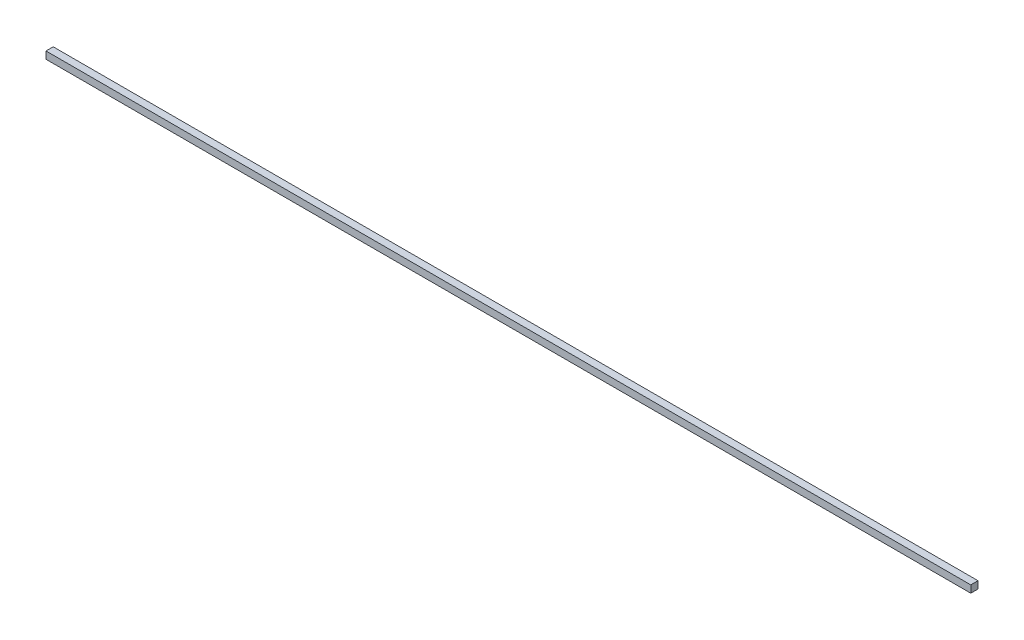
ISO-10303-21;
HEADER;
FILE_DESCRIPTION(('STEP AP214'),'2;1');
FILE_NAME('part.step','',(''),(''),'','','');
FILE_SCHEMA(('AUTOMOTIVE_DESIGN { 1 0 10303 214 1 1 1 1 }'));
ENDSEC;
DATA;
#1=APPLICATION_CONTEXT('core data for automotive mechanical design processes');
#2=APPLICATION_PROTOCOL_DEFINITION('international standard','automotive_design',2000,#1);
#3=PRODUCT_CONTEXT('',#1,'mechanical');
#4=PRODUCT('Part','Part','',(#3));
#5=PRODUCT_RELATED_PRODUCT_CATEGORY('part','',(#4));
#6=PRODUCT_DEFINITION_FORMATION('','',#4);
#7=PRODUCT_DEFINITION_CONTEXT('part definition',#1,'design');
#8=PRODUCT_DEFINITION('design','',#6,#7);
#9=PRODUCT_DEFINITION_SHAPE('','',#8);
#10=(LENGTH_UNIT() NAMED_UNIT(*) SI_UNIT(.MILLI.,.METRE.));
#11=(NAMED_UNIT(*) PLANE_ANGLE_UNIT() SI_UNIT($,.RADIAN.));
#12=(NAMED_UNIT(*) SI_UNIT($,.STERADIAN.) SOLID_ANGLE_UNIT());
#13=UNCERTAINTY_MEASURE_WITH_UNIT(LENGTH_MEASURE(1.E-05),#10,'distance_accuracy_value','');
#14=(GEOMETRIC_REPRESENTATION_CONTEXT(3) GLOBAL_UNCERTAINTY_ASSIGNED_CONTEXT((#13)) GLOBAL_UNIT_ASSIGNED_CONTEXT((#10,
#11,#12)) REPRESENTATION_CONTEXT('',''));
#15=CARTESIAN_POINT('',(0.,0.,0.));
#16=DIRECTION('',(0.,0.,1.));
#17=DIRECTION('',(1.,0.,0.));
#18=AXIS2_PLACEMENT_3D('',#15,#16,#17);
#19=CARTESIAN_POINT('',(812.8,0.,0.));
#20=DIRECTION('',(0.,0.,1.));
#21=DIRECTION('',(1.,0.,0.));
#22=AXIS2_PLACEMENT_3D('',#19,#20,#21);
#23=PLANE('',#22);
#24=DIRECTION('',(0.,1.,0.));
#25=VECTOR('',#24,1.);
#26=CARTESIAN_POINT('',(0.,0.,0.));
#27=LINE('',#26,#25);
#28=CARTESIAN_POINT('',(0.,0.,0.));
#29=VERTEX_POINT('',#28);
#30=CARTESIAN_POINT('',(0.,6.35,0.));
#31=VERTEX_POINT('',#30);
#32=EDGE_CURVE('E110',#29,#31,#27,.T.);
#33=ORIENTED_EDGE('',*,*,#32,.F.);
#34=DIRECTION('',(-1.,0.,0.));
#35=VECTOR('',#34,1.);
#36=CARTESIAN_POINT('',(812.8,0.,0.));
#37=LINE('',#36,#35);
#38=CARTESIAN_POINT('',(812.8,0.,0.));
#39=VERTEX_POINT('',#38);
#40=EDGE_CURVE('E11',#39,#29,#37,.T.);
#41=ORIENTED_EDGE('',*,*,#40,.F.);
#42=DIRECTION('',(0.,1.,0.));
#43=VECTOR('',#42,1.);
#44=CARTESIAN_POINT('',(812.8,0.,0.));
#45=LINE('',#44,#43);
#46=CARTESIAN_POINT('',(812.8,6.35,0.));
#47=VERTEX_POINT('',#46);
#48=EDGE_CURVE('E103',#39,#47,#45,.T.);
#49=ORIENTED_EDGE('',*,*,#48,.T.);
#50=DIRECTION('',(-1.,0.,0.));
#51=VECTOR('',#50,1.);
#52=CARTESIAN_POINT('',(812.8,6.35,0.));
#53=LINE('',#52,#51);
#54=EDGE_CURVE('E42',#47,#31,#53,.T.);
#55=ORIENTED_EDGE('',*,*,#54,.T.);
#56=EDGE_LOOP('',(#33,#41,#49,#55));
#57=FACE_BOUND('',#56,.T.);
#58=ADVANCED_FACE('F39',(#57),#23,.T.);
#59=CARTESIAN_POINT('',(812.8,0.,0.));
#60=DIRECTION('',(0.,1.,0.));
#61=DIRECTION('',(0.,0.,1.));
#62=AXIS2_PLACEMENT_3D('',#59,#60,#61);
#63=PLANE('',#62);
#64=DIRECTION('',(0.,0.,-1.));
#65=VECTOR('',#64,1.);
#66=CARTESIAN_POINT('',(0.,0.,0.));
#67=LINE('',#66,#65);
#68=CARTESIAN_POINT('',(0.,0.,-6.35));
#69=VERTEX_POINT('',#68);
#70=EDGE_CURVE('E73',#29,#69,#67,.T.);
#71=ORIENTED_EDGE('',*,*,#70,.T.);
#72=DIRECTION('',(-1.,0.,0.));
#73=VECTOR('',#72,1.);
#74=CARTESIAN_POINT('',(812.8,0.,-6.35));
#75=LINE('',#74,#73);
#76=CARTESIAN_POINT('',(812.8,0.,-6.35));
#77=VERTEX_POINT('',#76);
#78=EDGE_CURVE('E49',#77,#69,#75,.T.);
#79=ORIENTED_EDGE('',*,*,#78,.F.);
#80=DIRECTION('',(0.,0.,-1.));
#81=VECTOR('',#80,1.);
#82=CARTESIAN_POINT('',(812.8,0.,0.));
#83=LINE('',#82,#81);
#84=EDGE_CURVE('E90',#39,#77,#83,.T.);
#85=ORIENTED_EDGE('',*,*,#84,.F.);
#86=ORIENTED_EDGE('',*,*,#40,.T.);
#87=EDGE_LOOP('',(#71,#79,#85,#86));
#88=FACE_BOUND('',#87,.T.);
#89=ADVANCED_FACE('F126',(#88),#63,.F.);
#90=CARTESIAN_POINT('',(812.8,0.,-6.35));
#91=DIRECTION('',(0.,0.,1.));
#92=DIRECTION('',(1.,0.,0.));
#93=AXIS2_PLACEMENT_3D('',#90,#91,#92);
#94=PLANE('',#93);
#95=DIRECTION('',(0.,1.,0.));
#96=VECTOR('',#95,1.);
#97=CARTESIAN_POINT('',(0.,0.,-6.35));
#98=LINE('',#97,#96);
#99=CARTESIAN_POINT('',(0.,6.35,-6.35));
#100=VERTEX_POINT('',#99);
#101=EDGE_CURVE('E98',#69,#100,#98,.T.);
#102=ORIENTED_EDGE('',*,*,#101,.T.);
#103=DIRECTION('',(-1.,0.,0.));
#104=VECTOR('',#103,1.);
#105=CARTESIAN_POINT('',(812.8,6.35,-6.35));
#106=LINE('',#105,#104);
#107=CARTESIAN_POINT('',(812.8,6.35,-6.35));
#108=VERTEX_POINT('',#107);
#109=EDGE_CURVE('E95',#108,#100,#106,.T.);
#110=ORIENTED_EDGE('',*,*,#109,.F.);
#111=DIRECTION('',(0.,1.,0.));
#112=VECTOR('',#111,1.);
#113=CARTESIAN_POINT('',(812.8,0.,-6.35));
#114=LINE('',#113,#112);
#115=EDGE_CURVE('E85',#77,#108,#114,.T.);
#116=ORIENTED_EDGE('',*,*,#115,.F.);
#117=ORIENTED_EDGE('',*,*,#78,.T.);
#118=EDGE_LOOP('',(#102,#110,#116,#117));
#119=FACE_BOUND('',#118,.T.);
#120=ADVANCED_FACE('F96',(#119),#94,.F.);
#121=CARTESIAN_POINT('',(812.8,6.35,0.));
#122=DIRECTION('',(0.,1.,0.));
#123=DIRECTION('',(0.,0.,1.));
#124=AXIS2_PLACEMENT_3D('',#121,#122,#123);
#125=PLANE('',#124);
#126=DIRECTION('',(0.,0.,-1.));
#127=VECTOR('',#126,1.);
#128=CARTESIAN_POINT('',(0.,6.35,0.));
#129=LINE('',#128,#127);
#130=EDGE_CURVE('E114',#31,#100,#129,.T.);
#131=ORIENTED_EDGE('',*,*,#130,.F.);
#132=ORIENTED_EDGE('',*,*,#54,.F.);
#133=DIRECTION('',(0.,0.,-1.));
#134=VECTOR('',#133,1.);
#135=CARTESIAN_POINT('',(812.8,6.35,0.));
#136=LINE('',#135,#134);
#137=EDGE_CURVE('E89',#47,#108,#136,.T.);
#138=ORIENTED_EDGE('',*,*,#137,.T.);
#139=ORIENTED_EDGE('',*,*,#109,.T.);
#140=EDGE_LOOP('',(#131,#132,#138,#139));
#141=FACE_BOUND('',#140,.T.);
#142=ADVANCED_FACE('F101',(#141),#125,.T.);
#143=CARTESIAN_POINT('',(812.8,0.,0.));
#144=DIRECTION('',(-1.,0.,0.));
#145=DIRECTION('',(0.,0.,1.));
#146=AXIS2_PLACEMENT_3D('',#143,#144,#145);
#147=PLANE('',#146);
#148=ORIENTED_EDGE('',*,*,#48,.F.);
#149=ORIENTED_EDGE('',*,*,#84,.T.);
#150=ORIENTED_EDGE('',*,*,#115,.T.);
#151=ORIENTED_EDGE('',*,*,#137,.F.);
#152=EDGE_LOOP('',(#148,#149,#150,#151));
#153=FACE_BOUND('',#152,.T.);
#154=ADVANCED_FACE('F88',(#153),#147,.F.);
#155=CARTESIAN_POINT('',(0.,0.,0.));
#156=DIRECTION('',(-1.,0.,0.));
#157=DIRECTION('',(0.,0.,1.));
#158=AXIS2_PLACEMENT_3D('',#155,#156,#157);
#159=PLANE('',#158);
#160=ORIENTED_EDGE('',*,*,#32,.T.);
#161=ORIENTED_EDGE('',*,*,#130,.T.);
#162=ORIENTED_EDGE('',*,*,#101,.F.);
#163=ORIENTED_EDGE('',*,*,#70,.F.);
#164=EDGE_LOOP('',(#160,#161,#162,#163));
#165=FACE_BOUND('',#164,.T.);
#166=ADVANCED_FACE('F123',(#165),#159,.T.);
#167=CLOSED_SHELL('',(#58,#89,#120,#142,#154,#166));
#168=MANIFOLD_SOLID_BREP('B2',#167);
#169=ADVANCED_BREP_SHAPE_REPRESENTATION('',(#18,#168),#14);
#170=SHAPE_DEFINITION_REPRESENTATION(#9,#169);
ENDSEC;
END-ISO-10303-21;
